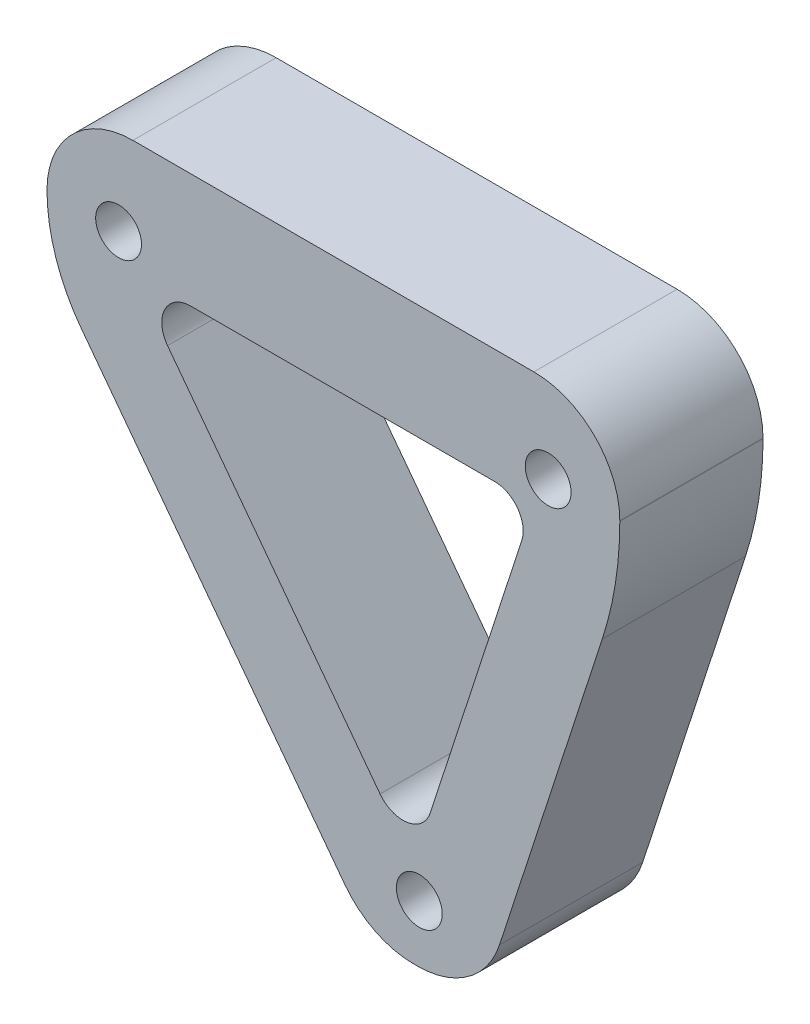
ISO-10303-21;
HEADER;
FILE_DESCRIPTION(('STEP AP214'),'2;1');
FILE_NAME('part.step','',(''),(''),'','','');
FILE_SCHEMA(('AUTOMOTIVE_DESIGN { 1 0 10303 214 1 1 1 1 }'));
ENDSEC;
DATA;
#1=APPLICATION_CONTEXT('core data for automotive mechanical design processes');
#2=APPLICATION_PROTOCOL_DEFINITION('international standard','automotive_design',2000,#1);
#3=PRODUCT_CONTEXT('',#1,'mechanical');
#4=PRODUCT('Part','Part','',(#3));
#5=PRODUCT_RELATED_PRODUCT_CATEGORY('part','',(#4));
#6=PRODUCT_DEFINITION_FORMATION('','',#4);
#7=PRODUCT_DEFINITION_CONTEXT('part definition',#1,'design');
#8=PRODUCT_DEFINITION('design','',#6,#7);
#9=PRODUCT_DEFINITION_SHAPE('','',#8);
#10=(LENGTH_UNIT() NAMED_UNIT(*) SI_UNIT(.MILLI.,.METRE.));
#11=(NAMED_UNIT(*) PLANE_ANGLE_UNIT() SI_UNIT($,.RADIAN.));
#12=(NAMED_UNIT(*) SI_UNIT($,.STERADIAN.) SOLID_ANGLE_UNIT());
#13=UNCERTAINTY_MEASURE_WITH_UNIT(LENGTH_MEASURE(1.E-05),#10,'distance_accuracy_value','');
#14=(GEOMETRIC_REPRESENTATION_CONTEXT(3) GLOBAL_UNCERTAINTY_ASSIGNED_CONTEXT((#13)) GLOBAL_UNIT_ASSIGNED_CONTEXT((#10,
#11,#12)) REPRESENTATION_CONTEXT('',''));
#15=CARTESIAN_POINT('',(0.,0.,0.));
#16=DIRECTION('',(0.,0.,1.));
#17=DIRECTION('',(1.,0.,0.));
#18=AXIS2_PLACEMENT_3D('',#15,#16,#17);
#19=CARTESIAN_POINT('',(36.180339887499,-11.7557050458494,10.));
#20=DIRECTION('',(-0.951056516295155,0.309016994374945,0.));
#21=DIRECTION('',(-0.309016994374945,-0.951056516295155,0.));
#22=AXIS2_PLACEMENT_3D('',#19,#20,#21);
#23=PLANE('',#22);
#24=DIRECTION('',(0.309016994374945,0.951056516295155,0.));
#25=VECTOR('',#24,1.);
#26=CARTESIAN_POINT('',(36.180339887499,-11.7557050458494,0.));
#27=LINE('',#26,#25);
#28=CARTESIAN_POINT('',(31.5994930427517,-25.8541019662496,0.));
#29=VERTEX_POINT('',#28);
#30=CARTESIAN_POINT('',(38.7764129073789,-3.76581385126026,0.));
#31=VERTEX_POINT('',#30);
#32=EDGE_CURVE('E303',#29,#31,#27,.T.);
#33=ORIENTED_EDGE('',*,*,#32,.T.);
#34=DIRECTION('',(0.,0.,-1.));
#35=VECTOR('',#34,1.);
#36=CARTESIAN_POINT('',(38.7764129073789,-3.76581385126026,10.));
#37=LINE('',#36,#35);
#38=CARTESIAN_POINT('',(38.7764129073789,-3.76581385126026,10.));
#39=VERTEX_POINT('',#38);
#40=EDGE_CURVE('E12',#39,#31,#37,.T.);
#41=ORIENTED_EDGE('',*,*,#40,.F.);
#42=DIRECTION('',(0.309016994374945,0.951056516295155,0.));
#43=VECTOR('',#42,1.);
#44=CARTESIAN_POINT('',(36.180339887499,-11.7557050458494,10.));
#45=LINE('',#44,#43);
#46=CARTESIAN_POINT('',(31.5994930427517,-25.8541019662496,10.));
#47=VERTEX_POINT('',#46);
#48=EDGE_CURVE('E267',#47,#39,#45,.T.);
#49=ORIENTED_EDGE('',*,*,#48,.F.);
#50=DIRECTION('',(0.,0.,-1.));
#51=VECTOR('',#50,1.);
#52=CARTESIAN_POINT('',(31.5994930427517,-25.8541019662496,10.));
#53=LINE('',#52,#51);
#54=EDGE_CURVE('E294',#47,#29,#53,.T.);
#55=ORIENTED_EDGE('',*,*,#54,.T.);
#56=EDGE_LOOP('',(#33,#41,#49,#55));
#57=FACE_BOUND('',#56,.T.);
#58=ADVANCED_FACE('F83',(#57),#23,.F.);
#59=CARTESIAN_POINT('',(15.,3.95961100811336,10.));
#60=DIRECTION('',(0.,0.,-1.));
#61=DIRECTION('',(-1.,0.,0.));
#62=AXIS2_PLACEMENT_3D('',#59,#60,#61);
#63=CYLINDRICAL_SURFACE('',#62,25.);
#64=CARTESIAN_POINT('',(15.,3.95961100811336,0.));
#65=DIRECTION('',(0.,0.,1.));
#66=DIRECTION('',(1.,0.,0.));
#67=AXIS2_PLACEMENT_3D('',#64,#65,#66);
#68=CIRCLE('',#67,25.);
#69=CARTESIAN_POINT('',(40.,3.95961100811336,0.));
#70=VERTEX_POINT('',#69);
#71=EDGE_CURVE('E306',#31,#70,#68,.T.);
#72=ORIENTED_EDGE('',*,*,#71,.T.);
#73=DIRECTION('',(0.,0.,-1.));
#74=VECTOR('',#73,1.);
#75=CARTESIAN_POINT('',(40.,3.95961100811336,10.));
#76=LINE('',#75,#74);
#77=CARTESIAN_POINT('',(40.,3.95961100811336,10.));
#78=VERTEX_POINT('',#77);
#79=EDGE_CURVE('E91',#78,#70,#76,.T.);
#80=ORIENTED_EDGE('',*,*,#79,.F.);
#81=CARTESIAN_POINT('',(15.,3.95961100811336,10.));
#82=DIRECTION('',(0.,0.,1.));
#83=DIRECTION('',(1.,0.,0.));
#84=AXIS2_PLACEMENT_3D('',#81,#82,#83);
#85=CIRCLE('',#84,25.);
#86=EDGE_CURVE('E270',#39,#78,#85,.T.);
#87=ORIENTED_EDGE('',*,*,#86,.F.);
#88=ORIENTED_EDGE('',*,*,#40,.T.);
#89=EDGE_LOOP('',(#72,#80,#87,#88));
#90=FACE_BOUND('',#89,.T.);
#91=ADVANCED_FACE('F372',(#90),#63,.T.);
#92=CARTESIAN_POINT('',(39.9999999999993,-6.87206447082378E-12,10.));
#93=DIRECTION('',(-1.,1.71801611770598E-13,0.));
#94=DIRECTION('',(-1.71801611770598E-13,-1.,0.));
#95=AXIS2_PLACEMENT_3D('',#92,#93,#94);
#96=PLANE('',#95);
#97=DIRECTION('',(1.71801611770598E-13,1.,0.));
#98=VECTOR('',#97,1.);
#99=CARTESIAN_POINT('',(39.9999999999993,-6.87206447082378E-12,0.));
#100=LINE('',#99,#98);
#101=CARTESIAN_POINT('',(40.,3.99999999999996,0.));
#102=VERTEX_POINT('',#101);
#103=EDGE_CURVE('E308',#70,#102,#100,.T.);
#104=ORIENTED_EDGE('',*,*,#103,.T.);
#105=DIRECTION('',(0.,0.,-1.));
#106=VECTOR('',#105,1.);
#107=CARTESIAN_POINT('',(40.,3.99999999999996,10.));
#108=LINE('',#107,#106);
#109=CARTESIAN_POINT('',(40.,3.99999999999996,10.));
#110=VERTEX_POINT('',#109);
#111=EDGE_CURVE('E348',#110,#102,#108,.T.);
#112=ORIENTED_EDGE('',*,*,#111,.F.);
#113=DIRECTION('',(1.71801611770598E-13,1.,0.));
#114=VECTOR('',#113,1.);
#115=CARTESIAN_POINT('',(39.9999999999993,-6.87206447082378E-12,10.));
#116=LINE('',#115,#114);
#117=EDGE_CURVE('E272',#78,#110,#116,.T.);
#118=ORIENTED_EDGE('',*,*,#117,.F.);
#119=ORIENTED_EDGE('',*,*,#79,.T.);
#120=EDGE_LOOP('',(#104,#112,#118,#119));
#121=FACE_BOUND('',#120,.T.);
#122=ADVANCED_FACE('F355',(#121),#96,.F.);
#123=CARTESIAN_POINT('',(34.,4.,10.));
#124=DIRECTION('',(0.,0.,-1.));
#125=DIRECTION('',(-1.,0.,0.));
#126=AXIS2_PLACEMENT_3D('',#123,#124,#125);
#127=CYLINDRICAL_SURFACE('',#126,6.);
#128=CARTESIAN_POINT('',(34.,4.,0.));
#129=DIRECTION('',(0.,0.,1.));
#130=DIRECTION('',(1.,0.,0.));
#131=AXIS2_PLACEMENT_3D('',#128,#129,#130);
#132=CIRCLE('',#131,6.);
#133=CARTESIAN_POINT('',(34.,10.,0.));
#134=VERTEX_POINT('',#133);
#135=EDGE_CURVE('E310',#102,#134,#132,.T.);
#136=ORIENTED_EDGE('',*,*,#135,.T.);
#137=DIRECTION('',(0.,0.,-1.));
#138=VECTOR('',#137,1.);
#139=CARTESIAN_POINT('',(34.,10.,10.));
#140=LINE('',#139,#138);
#141=CARTESIAN_POINT('',(34.,10.,10.));
#142=VERTEX_POINT('',#141);
#143=EDGE_CURVE('E346',#142,#134,#140,.T.);
#144=ORIENTED_EDGE('',*,*,#143,.F.);
#145=CARTESIAN_POINT('',(34.,4.,10.));
#146=DIRECTION('',(0.,0.,1.));
#147=DIRECTION('',(1.,0.,0.));
#148=AXIS2_PLACEMENT_3D('',#145,#146,#147);
#149=CIRCLE('',#148,6.);
#150=EDGE_CURVE('E274',#110,#142,#149,.T.);
#151=ORIENTED_EDGE('',*,*,#150,.F.);
#152=ORIENTED_EDGE('',*,*,#111,.T.);
#153=EDGE_LOOP('',(#136,#144,#151,#152));
#154=FACE_BOUND('',#153,.T.);
#155=ADVANCED_FACE('F364',(#154),#127,.T.);
#156=CARTESIAN_POINT('',(0.,10.,10.));
#157=DIRECTION('',(0.,1.,0.));
#158=DIRECTION('',(0.,0.,1.));
#159=AXIS2_PLACEMENT_3D('',#156,#157,#158);
#160=PLANE('',#159);
#161=DIRECTION('',(1.,0.,0.));
#162=VECTOR('',#161,1.);
#163=CARTESIAN_POINT('',(0.,10.,0.));
#164=LINE('',#163,#162);
#165=CARTESIAN_POINT('',(6.00000000000004,10.,0.));
#166=VERTEX_POINT('',#165);
#167=EDGE_CURVE('E313',#166,#134,#164,.T.);
#168=ORIENTED_EDGE('',*,*,#167,.F.);
#169=DIRECTION('',(0.,0.,-1.));
#170=VECTOR('',#169,1.);
#171=CARTESIAN_POINT('',(6.00000000000004,10.,10.));
#172=LINE('',#171,#170);
#173=CARTESIAN_POINT('',(6.00000000000004,10.,10.));
#174=VERTEX_POINT('',#173);
#175=EDGE_CURVE('E344',#174,#166,#172,.T.);
#176=ORIENTED_EDGE('',*,*,#175,.F.);
#177=DIRECTION('',(1.,0.,0.));
#178=VECTOR('',#177,1.);
#179=CARTESIAN_POINT('',(0.,10.,10.));
#180=LINE('',#179,#178);
#181=EDGE_CURVE('E276',#174,#142,#180,.T.);
#182=ORIENTED_EDGE('',*,*,#181,.T.);
#183=ORIENTED_EDGE('',*,*,#143,.T.);
#184=EDGE_LOOP('',(#168,#176,#182,#183));
#185=FACE_BOUND('',#184,.T.);
#186=ADVANCED_FACE('F400',(#185),#160,.T.);
#187=CARTESIAN_POINT('',(6.,4.,10.));
#188=DIRECTION('',(0.,0.,-1.));
#189=DIRECTION('',(-1.,0.,0.));
#190=AXIS2_PLACEMENT_3D('',#187,#188,#189);
#191=CYLINDRICAL_SURFACE('',#190,6.);
#192=CARTESIAN_POINT('',(6.,4.,0.));
#193=DIRECTION('',(0.,0.,1.));
#194=DIRECTION('',(1.,0.,0.));
#195=AXIS2_PLACEMENT_3D('',#192,#193,#194);
#196=CIRCLE('',#195,6.);
#197=CARTESIAN_POINT('',(0.,3.99999999999996,0.));
#198=VERTEX_POINT('',#197);
#199=EDGE_CURVE('E316',#198,#166,#196,.F.);
#200=ORIENTED_EDGE('',*,*,#199,.F.);
#201=DIRECTION('',(0.,0.,-1.));
#202=VECTOR('',#201,1.);
#203=CARTESIAN_POINT('',(0.,3.99999999999996,10.));
#204=LINE('',#203,#202);
#205=CARTESIAN_POINT('',(0.,3.99999999999996,10.));
#206=VERTEX_POINT('',#205);
#207=EDGE_CURVE('E342',#206,#198,#204,.T.);
#208=ORIENTED_EDGE('',*,*,#207,.F.);
#209=CARTESIAN_POINT('',(6.,4.,10.));
#210=DIRECTION('',(0.,0.,1.));
#211=DIRECTION('',(1.,0.,0.));
#212=AXIS2_PLACEMENT_3D('',#209,#210,#211);
#213=CIRCLE('',#212,6.);
#214=EDGE_CURVE('E279',#206,#174,#213,.F.);
#215=ORIENTED_EDGE('',*,*,#214,.T.);
#216=ORIENTED_EDGE('',*,*,#175,.T.);
#217=EDGE_LOOP('',(#200,#208,#215,#216));
#218=FACE_BOUND('',#217,.T.);
#219=ADVANCED_FACE('F398',(#218),#191,.T.);
#220=CARTESIAN_POINT('',(12.,4.01514383402487,10.));
#221=DIRECTION('',(0.,0.,-1.));
#222=DIRECTION('',(-1.,0.,0.));
#223=AXIS2_PLACEMENT_3D('',#220,#221,#222);
#224=CYLINDRICAL_SURFACE('',#223,12.);
#225=CARTESIAN_POINT('',(12.,4.01514383402487,0.));
#226=DIRECTION('',(0.,0.,1.));
#227=DIRECTION('',(1.,0.,0.));
#228=AXIS2_PLACEMENT_3D('',#225,#226,#227);
#229=CIRCLE('',#228,12.);
#230=CARTESIAN_POINT('',(2.41637387943247,-3.20663644379969,0.));
#231=VERTEX_POINT('',#230);
#232=EDGE_CURVE('E319',#231,#198,#229,.F.);
#233=ORIENTED_EDGE('',*,*,#232,.F.);
#234=DIRECTION('',(0.,0.,-1.));
#235=VECTOR('',#234,1.);
#236=CARTESIAN_POINT('',(2.41637387943247,-3.20663644379969,10.));
#237=LINE('',#236,#235);
#238=CARTESIAN_POINT('',(2.41637387943247,-3.20663644379969,10.));
#239=VERTEX_POINT('',#238);
#240=EDGE_CURVE('E340',#239,#231,#237,.T.);
#241=ORIENTED_EDGE('',*,*,#240,.F.);
#242=CARTESIAN_POINT('',(12.,4.01514383402487,10.));
#243=DIRECTION('',(0.,0.,1.));
#244=DIRECTION('',(1.,0.,0.));
#245=AXIS2_PLACEMENT_3D('',#242,#243,#244);
#246=CIRCLE('',#245,12.);
#247=EDGE_CURVE('E282',#239,#206,#246,.F.);
#248=ORIENTED_EDGE('',*,*,#247,.T.);
#249=ORIENTED_EDGE('',*,*,#207,.T.);
#250=EDGE_LOOP('',(#233,#241,#248,#249));
#251=FACE_BOUND('',#250,.T.);
#252=ADVANCED_FACE('F393',(#251),#224,.T.);
#253=CARTESIAN_POINT('',(0.,0.,10.));
#254=DIRECTION('',(0.798635510047294,0.601815023152047,0.));
#255=DIRECTION('',(-0.601815023152047,0.798635510047294,0.));
#256=AXIS2_PLACEMENT_3D('',#253,#254,#255);
#257=PLANE('',#256);
#258=DIRECTION('',(0.601815023152047,-0.798635510047294,0.));
#259=VECTOR('',#258,1.);
#260=CARTESIAN_POINT('',(0.,0.,0.));
#261=LINE('',#260,#259);
#262=CARTESIAN_POINT('',(20.8062980911205,-27.6108901389123,0.));
#263=VERTEX_POINT('',#262);
#264=EDGE_CURVE('E322',#231,#263,#261,.T.);
#265=ORIENTED_EDGE('',*,*,#264,.T.);
#266=DIRECTION('',(0.,0.,-1.));
#267=VECTOR('',#266,1.);
#268=CARTESIAN_POINT('',(20.8062980911205,-27.6108901389123,10.));
#269=LINE('',#268,#267);
#270=CARTESIAN_POINT('',(20.8062980911205,-27.6108901389123,10.));
#271=VERTEX_POINT('',#270);
#272=EDGE_CURVE('E338',#271,#263,#269,.T.);
#273=ORIENTED_EDGE('',*,*,#272,.F.);
#274=DIRECTION('',(0.601815023152047,-0.798635510047294,0.));
#275=VECTOR('',#274,1.);
#276=CARTESIAN_POINT('',(0.,0.,10.));
#277=LINE('',#276,#275);
#278=EDGE_CURVE('E285',#239,#271,#277,.T.);
#279=ORIENTED_EDGE('',*,*,#278,.F.);
#280=ORIENTED_EDGE('',*,*,#240,.T.);
#281=EDGE_LOOP('',(#265,#273,#279,#280));
#282=FACE_BOUND('',#281,.T.);
#283=ADVANCED_FACE('F454',(#282),#257,.F.);
#284=CARTESIAN_POINT('',(25.5981111514043,-24.,10.));
#285=DIRECTION('',(0.,0.,-1.));
#286=DIRECTION('',(-1.,0.,0.));
#287=AXIS2_PLACEMENT_3D('',#284,#285,#286);
#288=CYLINDRICAL_SURFACE('',#287,6.);
#289=CARTESIAN_POINT('',(25.5981111514043,-24.,0.));
#290=DIRECTION('',(0.,0.,1.));
#291=DIRECTION('',(1.,0.,0.));
#292=AXIS2_PLACEMENT_3D('',#289,#290,#291);
#293=CIRCLE('',#292,6.);
#294=CARTESIAN_POINT('',(25.5981111514043,-30.,0.));
#295=VERTEX_POINT('',#294);
#296=EDGE_CURVE('E325',#295,#263,#293,.F.);
#297=ORIENTED_EDGE('',*,*,#296,.F.);
#298=DIRECTION('',(0.,0.,-1.));
#299=VECTOR('',#298,1.);
#300=CARTESIAN_POINT('',(25.5981111514043,-30.,10.));
#301=LINE('',#300,#299);
#302=CARTESIAN_POINT('',(25.5981111514043,-30.,10.));
#303=VERTEX_POINT('',#302);
#304=EDGE_CURVE('E336',#303,#295,#301,.T.);
#305=ORIENTED_EDGE('',*,*,#304,.F.);
#306=CARTESIAN_POINT('',(25.5981111514043,-24.,10.));
#307=DIRECTION('',(0.,0.,1.));
#308=DIRECTION('',(1.,0.,0.));
#309=AXIS2_PLACEMENT_3D('',#306,#307,#308);
#310=CIRCLE('',#309,6.);
#311=EDGE_CURVE('E287',#303,#271,#310,.F.);
#312=ORIENTED_EDGE('',*,*,#311,.T.);
#313=ORIENTED_EDGE('',*,*,#272,.T.);
#314=EDGE_LOOP('',(#297,#305,#312,#313));
#315=FACE_BOUND('',#314,.T.);
#316=ADVANCED_FACE('F387',(#315),#288,.T.);
#317=CARTESIAN_POINT('',(0.,-30.,10.));
#318=DIRECTION('',(0.,1.,0.));
#319=DIRECTION('',(0.,0.,1.));
#320=AXIS2_PLACEMENT_3D('',#317,#318,#319);
#321=PLANE('',#320);
#322=DIRECTION('',(1.,0.,0.));
#323=VECTOR('',#322,1.);
#324=CARTESIAN_POINT('',(0.,-30.,0.));
#325=LINE('',#324,#323);
#326=CARTESIAN_POINT('',(25.8931539449807,-30.,0.));
#327=VERTEX_POINT('',#326);
#328=EDGE_CURVE('E328',#295,#327,#325,.T.);
#329=ORIENTED_EDGE('',*,*,#328,.T.);
#330=DIRECTION('',(0.,0.,-1.));
#331=VECTOR('',#330,1.);
#332=CARTESIAN_POINT('',(25.8931539449807,-30.,10.));
#333=LINE('',#332,#331);
#334=CARTESIAN_POINT('',(25.8931539449807,-30.,10.));
#335=VERTEX_POINT('',#334);
#336=EDGE_CURVE('E333',#335,#327,#333,.T.);
#337=ORIENTED_EDGE('',*,*,#336,.F.);
#338=DIRECTION('',(1.,0.,0.));
#339=VECTOR('',#338,1.);
#340=CARTESIAN_POINT('',(0.,-30.,10.));
#341=LINE('',#340,#339);
#342=EDGE_CURVE('E290',#303,#335,#341,.T.);
#343=ORIENTED_EDGE('',*,*,#342,.F.);
#344=ORIENTED_EDGE('',*,*,#304,.T.);
#345=EDGE_LOOP('',(#329,#337,#343,#344));
#346=FACE_BOUND('',#345,.T.);
#347=ADVANCED_FACE('F384',(#346),#321,.F.);
#348=CARTESIAN_POINT('',(26.,-25.9924280829876,10.));
#349=DIRECTION('',(0.,0.,-1.));
#350=DIRECTION('',(-1.,0.,0.));
#351=AXIS2_PLACEMENT_3D('',#348,#349,#350);
#352=CYLINDRICAL_SURFACE('',#351,1.6);
#353=CARTESIAN_POINT('',(26.,-25.9924280829876,10.));
#354=DIRECTION('',(0.,0.,1.));
#355=DIRECTION('',(1.,0.,0.));
#356=AXIS2_PLACEMENT_3D('',#353,#354,#355);
#357=CIRCLE('',#356,1.6);
#358=CARTESIAN_POINT('',(27.6,-25.9924280829876,10.));
#359=VERTEX_POINT('',#358);
#360=EDGE_CURVE('E264',#359,#359,#357,.T.);
#361=ORIENTED_EDGE('',*,*,#360,.T.);
#362=EDGE_LOOP('',(#361));
#363=FACE_BOUND('',#362,.T.);
#364=CARTESIAN_POINT('',(26.,-25.9924280829876,0.));
#365=DIRECTION('',(0.,0.,1.));
#366=DIRECTION('',(1.,0.,0.));
#367=AXIS2_PLACEMENT_3D('',#364,#365,#366);
#368=CIRCLE('',#367,1.6);
#369=CARTESIAN_POINT('',(27.6,-25.9924280829876,0.));
#370=VERTEX_POINT('',#369);
#371=EDGE_CURVE('E300',#370,#370,#368,.T.);
#372=ORIENTED_EDGE('',*,*,#371,.F.);
#373=EDGE_LOOP('',(#372));
#374=FACE_BOUND('',#373,.T.);
#375=ADVANCED_FACE('F417',(#363,#374),#352,.F.);
#376=CARTESIAN_POINT('',(35.,4.00757191701244,10.));
#377=DIRECTION('',(0.,0.,-1.));
#378=DIRECTION('',(-1.,0.,0.));
#379=AXIS2_PLACEMENT_3D('',#376,#377,#378);
#380=CYLINDRICAL_SURFACE('',#379,1.6);
#381=CARTESIAN_POINT('',(35.,4.00757191701244,10.));
#382=DIRECTION('',(0.,0.,1.));
#383=DIRECTION('',(1.,0.,0.));
#384=AXIS2_PLACEMENT_3D('',#381,#382,#383);
#385=CIRCLE('',#384,1.6);
#386=CARTESIAN_POINT('',(36.6,4.00757191701244,10.));
#387=VERTEX_POINT('',#386);
#388=EDGE_CURVE('E260',#387,#387,#385,.T.);
#389=ORIENTED_EDGE('',*,*,#388,.T.);
#390=EDGE_LOOP('',(#389));
#391=FACE_BOUND('',#390,.T.);
#392=CARTESIAN_POINT('',(35.,4.00757191701244,0.));
#393=DIRECTION('',(0.,0.,1.));
#394=DIRECTION('',(1.,0.,0.));
#395=AXIS2_PLACEMENT_3D('',#392,#393,#394);
#396=CIRCLE('',#395,1.6);
#397=CARTESIAN_POINT('',(36.6,4.00757191701244,0.));
#398=VERTEX_POINT('',#397);
#399=EDGE_CURVE('E297',#398,#398,#396,.T.);
#400=ORIENTED_EDGE('',*,*,#399,.F.);
#401=EDGE_LOOP('',(#400));
#402=FACE_BOUND('',#401,.T.);
#403=ADVANCED_FACE('F419',(#391,#402),#380,.F.);
#404=CARTESIAN_POINT('',(5.,4.00757191701244,10.));
#405=DIRECTION('',(0.,0.,-1.));
#406=DIRECTION('',(-1.,0.,0.));
#407=AXIS2_PLACEMENT_3D('',#404,#405,#406);
#408=CYLINDRICAL_SURFACE('',#407,1.6);
#409=CARTESIAN_POINT('',(5.,4.00757191701244,10.));
#410=DIRECTION('',(0.,0.,1.));
#411=DIRECTION('',(1.,0.,0.));
#412=AXIS2_PLACEMENT_3D('',#409,#410,#411);
#413=CIRCLE('',#412,1.6);
#414=CARTESIAN_POINT('',(6.6,4.00757191701244,10.));
#415=VERTEX_POINT('',#414);
#416=EDGE_CURVE('E257',#415,#415,#413,.T.);
#417=ORIENTED_EDGE('',*,*,#416,.T.);
#418=EDGE_LOOP('',(#417));
#419=FACE_BOUND('',#418,.T.);
#420=CARTESIAN_POINT('',(5.,4.00757191701244,0.));
#421=DIRECTION('',(0.,0.,1.));
#422=DIRECTION('',(1.,0.,0.));
#423=AXIS2_PLACEMENT_3D('',#420,#421,#422);
#424=CIRCLE('',#423,1.6);
#425=CARTESIAN_POINT('',(6.6,4.00757191701244,0.));
#426=VERTEX_POINT('',#425);
#427=EDGE_CURVE('E250',#426,#426,#424,.T.);
#428=ORIENTED_EDGE('',*,*,#427,.F.);
#429=EDGE_LOOP('',(#428));
#430=FACE_BOUND('',#429,.T.);
#431=ADVANCED_FACE('F85',(#419,#430),#408,.F.);
#432=CARTESIAN_POINT('',(25.8931539449807,-24.,10.));
#433=DIRECTION('',(0.,0.,-1.));
#434=DIRECTION('',(-1.,0.,0.));
#435=AXIS2_PLACEMENT_3D('',#432,#433,#434);
#436=CYLINDRICAL_SURFACE('',#435,6.);
#437=CARTESIAN_POINT('',(25.8931539449807,-24.,0.));
#438=DIRECTION('',(0.,0.,1.));
#439=DIRECTION('',(1.,0.,0.));
#440=AXIS2_PLACEMENT_3D('',#437,#438,#439);
#441=CIRCLE('',#440,6.);
#442=EDGE_CURVE('E261',#327,#29,#441,.T.);
#443=ORIENTED_EDGE('',*,*,#442,.T.);
#444=ORIENTED_EDGE('',*,*,#54,.F.);
#445=CARTESIAN_POINT('',(25.8931539449807,-24.,10.));
#446=DIRECTION('',(0.,0.,1.));
#447=DIRECTION('',(1.,0.,0.));
#448=AXIS2_PLACEMENT_3D('',#445,#446,#447);
#449=CIRCLE('',#448,6.);
#450=EDGE_CURVE('E292',#335,#47,#449,.T.);
#451=ORIENTED_EDGE('',*,*,#450,.F.);
#452=ORIENTED_EDGE('',*,*,#336,.T.);
#453=EDGE_LOOP('',(#443,#444,#451,#452));
#454=FACE_BOUND('',#453,.T.);
#455=ADVANCED_FACE('F379',(#454),#436,.T.);
#456=CARTESIAN_POINT('',(0.,0.,10.));
#457=DIRECTION('',(0.,0.,1.));
#458=DIRECTION('',(1.,0.,0.));
#459=AXIS2_PLACEMENT_3D('',#456,#457,#458);
#460=PLANE('',#459);
#461=CARTESIAN_POINT('',(31.2529420077894,0.,10.));
#462=DIRECTION('',(0.,0.,1.));
#463=DIRECTION('',(1.,0.,0.));
#464=AXIS2_PLACEMENT_3D('',#461,#462,#463);
#465=CIRCLE('',#464,2.);
#466=CARTESIAN_POINT('',(33.1550550403797,-0.618033988749907,10.));
#467=VERTEX_POINT('',#466);
#468=CARTESIAN_POINT('',(31.2529420077894,2.,10.));
#469=VERTEX_POINT('',#468);
#470=EDGE_CURVE('E229',#467,#469,#465,.T.);
#471=ORIENTED_EDGE('',*,*,#470,.F.);
#472=DIRECTION('',(-0.309016994374944,-0.951056516295155,0.));
#473=VECTOR('',#472,1.);
#474=CARTESIAN_POINT('',(30.1706646407432,-9.80304319021508,10.));
#475=LINE('',#474,#473);
#476=CARTESIAN_POINT('',(26.7571727131787,-20.3086910999612,10.));
#477=VERTEX_POINT('',#476);
#478=EDGE_CURVE('E243',#467,#477,#475,.T.);
#479=ORIENTED_EDGE('',*,*,#478,.T.);
#480=CARTESIAN_POINT('',(24.8550596805884,-19.6906571112113,10.));
#481=DIRECTION('',(0.,0.,1.));
#482=DIRECTION('',(1.,0.,0.));
#483=AXIS2_PLACEMENT_3D('',#480,#481,#482);
#484=CIRCLE('',#483,2.);
#485=CARTESIAN_POINT('',(23.2577886604938,-20.8942871575154,10.));
#486=VERTEX_POINT('',#485);
#487=EDGE_CURVE('E240',#477,#486,#484,.F.);
#488=ORIENTED_EDGE('',*,*,#487,.T.);
#489=DIRECTION('',(-0.601815023152047,0.798635510047294,0.));
#490=VECTOR('',#489,1.);
#491=CARTESIAN_POINT('',(4.79181306028376,3.61089013891228,10.));
#492=LINE('',#491,#490);
#493=CARTESIAN_POINT('',(8.41981424515521,-1.20363004630412,10.));
#494=VERTEX_POINT('',#493);
#495=EDGE_CURVE('E98',#486,#494,#492,.T.);
#496=ORIENTED_EDGE('',*,*,#495,.T.);
#497=CARTESIAN_POINT('',(10.0170852652498,0.,10.));
#498=DIRECTION('',(0.,0.,1.));
#499=DIRECTION('',(1.,0.,0.));
#500=AXIS2_PLACEMENT_3D('',#497,#498,#499);
#501=CIRCLE('',#500,2.);
#502=CARTESIAN_POINT('',(10.0170852652498,2.,10.));
#503=VERTEX_POINT('',#502);
#504=EDGE_CURVE('E218',#494,#503,#501,.F.);
#505=ORIENTED_EDGE('',*,*,#504,.T.);
#506=DIRECTION('',(1.,0.,0.));
#507=VECTOR('',#506,1.);
#508=CARTESIAN_POINT('',(0.,2.,10.));
#509=LINE('',#508,#507);
#510=EDGE_CURVE('E226',#503,#469,#509,.T.);
#511=ORIENTED_EDGE('',*,*,#510,.T.);
#512=EDGE_LOOP('',(#471,#479,#488,#496,#505,#511));
#513=FACE_BOUND('',#512,.T.);
#514=ORIENTED_EDGE('',*,*,#416,.F.);
#515=EDGE_LOOP('',(#514));
#516=FACE_BOUND('',#515,.T.);
#517=ORIENTED_EDGE('',*,*,#388,.F.);
#518=EDGE_LOOP('',(#517));
#519=FACE_BOUND('',#518,.T.);
#520=ORIENTED_EDGE('',*,*,#360,.F.);
#521=EDGE_LOOP('',(#520));
#522=FACE_BOUND('',#521,.T.);
#523=ORIENTED_EDGE('',*,*,#48,.T.);
#524=ORIENTED_EDGE('',*,*,#86,.T.);
#525=ORIENTED_EDGE('',*,*,#117,.T.);
#526=ORIENTED_EDGE('',*,*,#150,.T.);
#527=ORIENTED_EDGE('',*,*,#181,.F.);
#528=ORIENTED_EDGE('',*,*,#214,.F.);
#529=ORIENTED_EDGE('',*,*,#247,.F.);
#530=ORIENTED_EDGE('',*,*,#278,.T.);
#531=ORIENTED_EDGE('',*,*,#311,.F.);
#532=ORIENTED_EDGE('',*,*,#342,.T.);
#533=ORIENTED_EDGE('',*,*,#450,.T.);
#534=EDGE_LOOP('',(#523,#524,#525,#526,#527,#528,#529,#530,#531,#532,#533));
#535=FACE_BOUND('',#534,.T.);
#536=ADVANCED_FACE('F368',(#513,#516,#519,#522,#535),#460,.T.);
#537=CARTESIAN_POINT('',(0.,0.,0.));
#538=DIRECTION('',(0.,0.,1.));
#539=DIRECTION('',(1.,0.,0.));
#540=AXIS2_PLACEMENT_3D('',#537,#538,#539);
#541=PLANE('',#540);
#542=DIRECTION('',(-0.309016994374944,-0.951056516295155,0.));
#543=VECTOR('',#542,1.);
#544=CARTESIAN_POINT('',(30.1706646407432,-9.80304319021508,0.));
#545=LINE('',#544,#543);
#546=CARTESIAN_POINT('',(33.1550550403797,-0.618033988749907,0.));
#547=VERTEX_POINT('',#546);
#548=CARTESIAN_POINT('',(26.7571727131787,-20.3086910999612,0.));
#549=VERTEX_POINT('',#548);
#550=EDGE_CURVE('E233',#547,#549,#545,.T.);
#551=ORIENTED_EDGE('',*,*,#550,.F.);
#552=CARTESIAN_POINT('',(31.2529420077894,0.,0.));
#553=DIRECTION('',(0.,0.,1.));
#554=DIRECTION('',(1.,0.,0.));
#555=AXIS2_PLACEMENT_3D('',#552,#553,#554);
#556=CIRCLE('',#555,2.);
#557=CARTESIAN_POINT('',(31.2529420077894,2.,0.));
#558=VERTEX_POINT('',#557);
#559=EDGE_CURVE('E235',#547,#558,#556,.T.);
#560=ORIENTED_EDGE('',*,*,#559,.T.);
#561=DIRECTION('',(1.,0.,0.));
#562=VECTOR('',#561,1.);
#563=CARTESIAN_POINT('',(0.,2.,0.));
#564=LINE('',#563,#562);
#565=CARTESIAN_POINT('',(10.0170852652498,2.,0.));
#566=VERTEX_POINT('',#565);
#567=EDGE_CURVE('E219',#566,#558,#564,.T.);
#568=ORIENTED_EDGE('',*,*,#567,.F.);
#569=CARTESIAN_POINT('',(10.0170852652498,0.,0.));
#570=DIRECTION('',(0.,0.,1.));
#571=DIRECTION('',(1.,0.,0.));
#572=AXIS2_PLACEMENT_3D('',#569,#570,#571);
#573=CIRCLE('',#572,2.);
#574=CARTESIAN_POINT('',(8.41981424515521,-1.20363004630412,0.));
#575=VERTEX_POINT('',#574);
#576=EDGE_CURVE('E211',#575,#566,#573,.F.);
#577=ORIENTED_EDGE('',*,*,#576,.F.);
#578=DIRECTION('',(-0.601815023152047,0.798635510047294,0.));
#579=VECTOR('',#578,1.);
#580=CARTESIAN_POINT('',(4.79181306028376,3.61089013891228,0.));
#581=LINE('',#580,#579);
#582=CARTESIAN_POINT('',(23.2577886604938,-20.8942871575154,0.));
#583=VERTEX_POINT('',#582);
#584=EDGE_CURVE('E201',#583,#575,#581,.T.);
#585=ORIENTED_EDGE('',*,*,#584,.F.);
#586=CARTESIAN_POINT('',(24.8550596805884,-19.6906571112113,0.));
#587=DIRECTION('',(0.,0.,1.));
#588=DIRECTION('',(1.,0.,0.));
#589=AXIS2_PLACEMENT_3D('',#586,#587,#588);
#590=CIRCLE('',#589,2.);
#591=EDGE_CURVE('E210',#549,#583,#590,.F.);
#592=ORIENTED_EDGE('',*,*,#591,.F.);
#593=EDGE_LOOP('',(#551,#560,#568,#577,#585,#592));
#594=FACE_BOUND('',#593,.T.);
#595=ORIENTED_EDGE('',*,*,#427,.T.);
#596=EDGE_LOOP('',(#595));
#597=FACE_BOUND('',#596,.T.);
#598=ORIENTED_EDGE('',*,*,#399,.T.);
#599=EDGE_LOOP('',(#598));
#600=FACE_BOUND('',#599,.T.);
#601=ORIENTED_EDGE('',*,*,#371,.T.);
#602=EDGE_LOOP('',(#601));
#603=FACE_BOUND('',#602,.T.);
#604=ORIENTED_EDGE('',*,*,#32,.F.);
#605=ORIENTED_EDGE('',*,*,#442,.F.);
#606=ORIENTED_EDGE('',*,*,#328,.F.);
#607=ORIENTED_EDGE('',*,*,#296,.T.);
#608=ORIENTED_EDGE('',*,*,#264,.F.);
#609=ORIENTED_EDGE('',*,*,#232,.T.);
#610=ORIENTED_EDGE('',*,*,#199,.T.);
#611=ORIENTED_EDGE('',*,*,#167,.T.);
#612=ORIENTED_EDGE('',*,*,#135,.F.);
#613=ORIENTED_EDGE('',*,*,#103,.F.);
#614=ORIENTED_EDGE('',*,*,#71,.F.);
#615=EDGE_LOOP('',(#604,#605,#606,#607,#608,#609,#610,#611,#612,#613,#614));
#616=FACE_BOUND('',#615,.T.);
#617=ADVANCED_FACE('F223',(#594,#597,#600,#603,#616),#541,.F.);
#618=CARTESIAN_POINT('',(30.1706646407432,-9.80304319021508,0.));
#619=DIRECTION('',(-0.951056516295155,0.309016994374944,0.));
#620=DIRECTION('',(-0.309016994374944,-0.951056516295155,0.));
#621=AXIS2_PLACEMENT_3D('',#618,#619,#620);
#622=PLANE('',#621);
#623=ORIENTED_EDGE('',*,*,#478,.F.);
#624=DIRECTION('',(0.,0.,1.));
#625=VECTOR('',#624,1.);
#626=CARTESIAN_POINT('',(33.1550550403797,-0.618033988749907,0.));
#627=LINE('',#626,#625);
#628=EDGE_CURVE('E253',#547,#467,#627,.T.);
#629=ORIENTED_EDGE('',*,*,#628,.F.);
#630=ORIENTED_EDGE('',*,*,#550,.T.);
#631=DIRECTION('',(0.,0.,1.));
#632=VECTOR('',#631,1.);
#633=CARTESIAN_POINT('',(26.7571727131787,-20.3086910999612,0.));
#634=LINE('',#633,#632);
#635=EDGE_CURVE('E106',#549,#477,#634,.T.);
#636=ORIENTED_EDGE('',*,*,#635,.T.);
#637=EDGE_LOOP('',(#623,#629,#630,#636));
#638=FACE_BOUND('',#637,.T.);
#639=ADVANCED_FACE('F433',(#638),#622,.T.);
#640=CARTESIAN_POINT('',(31.2529420077894,0.,0.));
#641=DIRECTION('',(0.,0.,1.));
#642=DIRECTION('',(1.,0.,0.));
#643=AXIS2_PLACEMENT_3D('',#640,#641,#642);
#644=CYLINDRICAL_SURFACE('',#643,2.);
#645=ORIENTED_EDGE('',*,*,#470,.T.);
#646=DIRECTION('',(0.,0.,1.));
#647=VECTOR('',#646,1.);
#648=CARTESIAN_POINT('',(31.2529420077894,2.,0.));
#649=LINE('',#648,#647);
#650=EDGE_CURVE('E251',#558,#469,#649,.T.);
#651=ORIENTED_EDGE('',*,*,#650,.F.);
#652=ORIENTED_EDGE('',*,*,#559,.F.);
#653=ORIENTED_EDGE('',*,*,#628,.T.);
#654=EDGE_LOOP('',(#645,#651,#652,#653));
#655=FACE_BOUND('',#654,.T.);
#656=ADVANCED_FACE('F441',(#655),#644,.F.);
#657=CARTESIAN_POINT('',(0.,2.,0.));
#658=DIRECTION('',(0.,-1.,0.));
#659=DIRECTION('',(1.,0.,0.));
#660=AXIS2_PLACEMENT_3D('',#657,#658,#659);
#661=PLANE('',#660);
#662=ORIENTED_EDGE('',*,*,#510,.F.);
#663=DIRECTION('',(0.,0.,1.));
#664=VECTOR('',#663,1.);
#665=CARTESIAN_POINT('',(10.0170852652498,2.,0.));
#666=LINE('',#665,#664);
#667=EDGE_CURVE('E248',#566,#503,#666,.T.);
#668=ORIENTED_EDGE('',*,*,#667,.F.);
#669=ORIENTED_EDGE('',*,*,#567,.T.);
#670=ORIENTED_EDGE('',*,*,#650,.T.);
#671=EDGE_LOOP('',(#662,#668,#669,#670));
#672=FACE_BOUND('',#671,.T.);
#673=ADVANCED_FACE('F520',(#672),#661,.T.);
#674=CARTESIAN_POINT('',(10.0170852652498,0.,0.));
#675=DIRECTION('',(0.,0.,1.));
#676=DIRECTION('',(1.,0.,0.));
#677=AXIS2_PLACEMENT_3D('',#674,#675,#676);
#678=CYLINDRICAL_SURFACE('',#677,2.);
#679=ORIENTED_EDGE('',*,*,#504,.F.);
#680=DIRECTION('',(0.,0.,1.));
#681=VECTOR('',#680,1.);
#682=CARTESIAN_POINT('',(8.41981424515521,-1.20363004630412,0.));
#683=LINE('',#682,#681);
#684=EDGE_CURVE('E204',#575,#494,#683,.T.);
#685=ORIENTED_EDGE('',*,*,#684,.F.);
#686=ORIENTED_EDGE('',*,*,#576,.T.);
#687=ORIENTED_EDGE('',*,*,#667,.T.);
#688=EDGE_LOOP('',(#679,#685,#686,#687));
#689=FACE_BOUND('',#688,.T.);
#690=ADVANCED_FACE('F214',(#689),#678,.F.);
#691=CARTESIAN_POINT('',(4.79181306028376,3.61089013891228,0.));
#692=DIRECTION('',(0.798635510047294,0.601815023152047,0.));
#693=DIRECTION('',(-0.601815023152047,0.798635510047294,0.));
#694=AXIS2_PLACEMENT_3D('',#691,#692,#693);
#695=PLANE('',#694);
#696=ORIENTED_EDGE('',*,*,#495,.F.);
#697=DIRECTION('',(0.,0.,1.));
#698=VECTOR('',#697,1.);
#699=CARTESIAN_POINT('',(23.2577886604938,-20.8942871575154,0.));
#700=LINE('',#699,#698);
#701=EDGE_CURVE('E206',#583,#486,#700,.T.);
#702=ORIENTED_EDGE('',*,*,#701,.F.);
#703=ORIENTED_EDGE('',*,*,#584,.T.);
#704=ORIENTED_EDGE('',*,*,#684,.T.);
#705=EDGE_LOOP('',(#696,#702,#703,#704));
#706=FACE_BOUND('',#705,.T.);
#707=ADVANCED_FACE('F203',(#706),#695,.T.);
#708=CARTESIAN_POINT('',(24.8550596805884,-19.6906571112113,0.));
#709=DIRECTION('',(0.,0.,1.));
#710=DIRECTION('',(1.,0.,0.));
#711=AXIS2_PLACEMENT_3D('',#708,#709,#710);
#712=CYLINDRICAL_SURFACE('',#711,2.);
#713=ORIENTED_EDGE('',*,*,#487,.F.);
#714=ORIENTED_EDGE('',*,*,#635,.F.);
#715=ORIENTED_EDGE('',*,*,#591,.T.);
#716=ORIENTED_EDGE('',*,*,#701,.T.);
#717=EDGE_LOOP('',(#713,#714,#715,#716));
#718=FACE_BOUND('',#717,.T.);
#719=ADVANCED_FACE('F549',(#718),#712,.F.);
#720=CLOSED_SHELL('',(#58,#91,#122,#155,#186,#219,#252,#283,#316,#347,#375,#403,#431,#455,#536,
#617,#639,#656,#673,#690,#707,#719));
#721=MANIFOLD_SOLID_BREP('B2',#720);
#722=ADVANCED_BREP_SHAPE_REPRESENTATION('',(#18,#721),#14);
#723=SHAPE_DEFINITION_REPRESENTATION(#9,#722);
ENDSEC;
END-ISO-10303-21;
